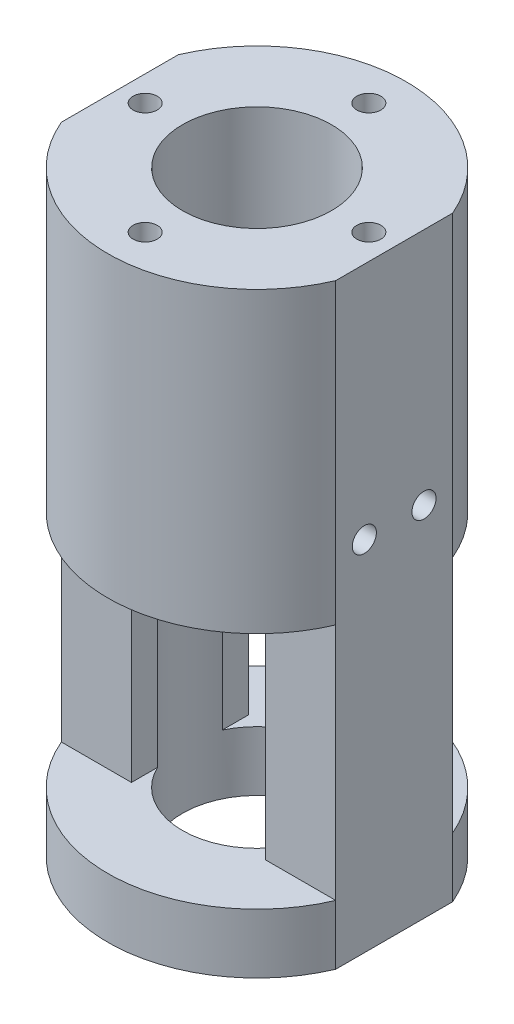
ISO-10303-21;
HEADER;
FILE_DESCRIPTION(('STEP AP214'),'2;1');
FILE_NAME('part.step','',(''),(''),'','','');
FILE_SCHEMA(('AUTOMOTIVE_DESIGN { 1 0 10303 214 1 1 1 1 }'));
ENDSEC;
DATA;
#1=APPLICATION_CONTEXT('core data for automotive mechanical design processes');
#2=APPLICATION_PROTOCOL_DEFINITION('international standard','automotive_design',2000,#1);
#3=PRODUCT_CONTEXT('',#1,'mechanical');
#4=PRODUCT('Part','Part','',(#3));
#5=PRODUCT_RELATED_PRODUCT_CATEGORY('part','',(#4));
#6=PRODUCT_DEFINITION_FORMATION('','',#4);
#7=PRODUCT_DEFINITION_CONTEXT('part definition',#1,'design');
#8=PRODUCT_DEFINITION('design','',#6,#7);
#9=PRODUCT_DEFINITION_SHAPE('','',#8);
#10=(LENGTH_UNIT() NAMED_UNIT(*) SI_UNIT(.MILLI.,.METRE.));
#11=(NAMED_UNIT(*) PLANE_ANGLE_UNIT() SI_UNIT($,.RADIAN.));
#12=(NAMED_UNIT(*) SI_UNIT($,.STERADIAN.) SOLID_ANGLE_UNIT());
#13=UNCERTAINTY_MEASURE_WITH_UNIT(LENGTH_MEASURE(1.E-05),#10,'distance_accuracy_value','');
#14=(GEOMETRIC_REPRESENTATION_CONTEXT(3) GLOBAL_UNCERTAINTY_ASSIGNED_CONTEXT((#13)) GLOBAL_UNIT_ASSIGNED_CONTEXT((#10,
#11,#12)) REPRESENTATION_CONTEXT('',''));
#15=CARTESIAN_POINT('',(0.,0.,0.));
#16=DIRECTION('',(0.,0.,1.));
#17=DIRECTION('',(1.,0.,0.));
#18=AXIS2_PLACEMENT_3D('',#15,#16,#17);
#19=CARTESIAN_POINT('',(0.,100.,0.));
#20=DIRECTION('',(0.,-1.,0.));
#21=DIRECTION('',(0.,0.,-1.));
#22=AXIS2_PLACEMENT_3D('',#19,#20,#21);
#23=CYLINDRICAL_SURFACE('',#22,25.);
#24=CARTESIAN_POINT('',(0.,50.,0.));
#25=DIRECTION('',(0.,-1.,0.));
#26=DIRECTION('',(0.,0.,-1.));
#27=AXIS2_PLACEMENT_3D('',#24,#25,#26);
#28=CIRCLE('',#27,25.);
#29=CARTESIAN_POINT('',(23.,50.,9.79795897113273));
#30=VERTEX_POINT('',#29);
#31=CARTESIAN_POINT('',(-23.,50.,9.79795897113273));
#32=VERTEX_POINT('',#31);
#33=EDGE_CURVE('E250',#30,#32,#28,.T.);
#34=ORIENTED_EDGE('',*,*,#33,.F.);
#35=DIRECTION('',(0.,-1.,0.));
#36=VECTOR('',#35,1.);
#37=CARTESIAN_POINT('',(23.,100.,9.79795897113272));
#38=LINE('',#37,#36);
#39=CARTESIAN_POINT('',(23.,100.,9.79795897113272));
#40=VERTEX_POINT('',#39);
#41=EDGE_CURVE('E297',#30,#40,#38,.F.);
#42=ORIENTED_EDGE('',*,*,#41,.T.);
#43=CARTESIAN_POINT('',(0.,100.,0.));
#44=DIRECTION('',(0.,1.,0.));
#45=DIRECTION('',(0.,0.,1.));
#46=AXIS2_PLACEMENT_3D('',#43,#44,#45);
#47=CIRCLE('',#46,25.);
#48=CARTESIAN_POINT('',(-23.,100.,9.79795897113271));
#49=VERTEX_POINT('',#48);
#50=EDGE_CURVE('E323',#49,#40,#47,.T.);
#51=ORIENTED_EDGE('',*,*,#50,.F.);
#52=DIRECTION('',(0.,-1.,0.));
#53=VECTOR('',#52,1.);
#54=CARTESIAN_POINT('',(-23.,100.,9.79795897113271));
#55=LINE('',#54,#53);
#56=EDGE_CURVE('E308',#32,#49,#55,.F.);
#57=ORIENTED_EDGE('',*,*,#56,.F.);
#58=EDGE_LOOP('',(#34,#42,#51,#57));
#59=FACE_BOUND('',#58,.T.);
#60=ADVANCED_FACE('F38',(#59),#23,.T.);
#61=CARTESIAN_POINT('',(0.,9.99999999999999,0.));
#62=DIRECTION('',(0.,1.,0.));
#63=DIRECTION('',(0.,0.,1.));
#64=AXIS2_PLACEMENT_3D('',#61,#62,#63);
#65=CIRCLE('',#64,25.);
#66=CARTESIAN_POINT('',(-23.,10.,9.79795897113274));
#67=VERTEX_POINT('',#66);
#68=CARTESIAN_POINT('',(23.,10.,9.79795897113272));
#69=VERTEX_POINT('',#68);
#70=EDGE_CURVE('E244',#67,#69,#65,.T.);
#71=ORIENTED_EDGE('',*,*,#70,.F.);
#72=CARTESIAN_POINT('',(-23.,0.,9.79795897113271));
#73=VERTEX_POINT('',#72);
#74=EDGE_CURVE('E309',#73,#67,#55,.F.);
#75=ORIENTED_EDGE('',*,*,#74,.F.);
#76=CARTESIAN_POINT('',(0.,0.,0.));
#77=DIRECTION('',(0.,1.,0.));
#78=DIRECTION('',(0.,0.,1.));
#79=AXIS2_PLACEMENT_3D('',#76,#77,#78);
#80=CIRCLE('',#79,25.);
#81=CARTESIAN_POINT('',(23.,0.,9.79795897113272));
#82=VERTEX_POINT('',#81);
#83=EDGE_CURVE('E328',#73,#82,#80,.T.);
#84=ORIENTED_EDGE('',*,*,#83,.T.);
#85=EDGE_CURVE('E298',#82,#69,#38,.F.);
#86=ORIENTED_EDGE('',*,*,#85,.T.);
#87=EDGE_LOOP('',(#71,#75,#84,#86));
#88=FACE_BOUND('',#87,.T.);
#89=ADVANCED_FACE('F403',(#88),#23,.T.);
#90=CARTESIAN_POINT('',(0.,100.,0.));
#91=DIRECTION('',(0.,-1.,0.));
#92=DIRECTION('',(0.,0.,-1.));
#93=AXIS2_PLACEMENT_3D('',#90,#91,#92);
#94=CYLINDRICAL_SURFACE('',#93,12.5);
#95=DIRECTION('',(0.,-1.,0.));
#96=VECTOR('',#95,1.);
#97=CARTESIAN_POINT('',(11.25,100.,5.44862367942584));
#98=LINE('',#97,#96);
#99=CARTESIAN_POINT('',(11.25,50.,5.44862367942584));
#100=VERTEX_POINT('',#99);
#101=CARTESIAN_POINT('',(11.25,10.,5.44862367942582));
#102=VERTEX_POINT('',#101);
#103=EDGE_CURVE('E223',#100,#102,#98,.T.);
#104=ORIENTED_EDGE('',*,*,#103,.F.);
#105=CARTESIAN_POINT('',(0.,50.,0.));
#106=DIRECTION('',(0.,-1.,0.));
#107=DIRECTION('',(0.,0.,-1.));
#108=AXIS2_PLACEMENT_3D('',#105,#106,#107);
#109=CIRCLE('',#108,12.5);
#110=CARTESIAN_POINT('',(-11.25,50.,5.4486236794258));
#111=VERTEX_POINT('',#110);
#112=EDGE_CURVE('E341',#100,#111,#109,.T.);
#113=ORIENTED_EDGE('',*,*,#112,.T.);
#114=DIRECTION('',(0.,-1.,0.));
#115=VECTOR('',#114,1.);
#116=CARTESIAN_POINT('',(-11.25,100.,5.44862367942575));
#117=LINE('',#116,#115);
#118=CARTESIAN_POINT('',(-11.25,10.,5.44862367942585));
#119=VERTEX_POINT('',#118);
#120=EDGE_CURVE('E229',#119,#111,#117,.F.);
#121=ORIENTED_EDGE('',*,*,#120,.F.);
#122=CARTESIAN_POINT('',(0.,9.99999999999999,0.));
#123=DIRECTION('',(0.,1.,0.));
#124=DIRECTION('',(0.,0.,1.));
#125=AXIS2_PLACEMENT_3D('',#122,#123,#124);
#126=CIRCLE('',#125,12.5);
#127=EDGE_CURVE('E339',#119,#102,#126,.T.);
#128=ORIENTED_EDGE('',*,*,#127,.T.);
#129=EDGE_LOOP('',(#104,#113,#121,#128));
#130=FACE_BOUND('',#129,.T.);
#131=DIRECTION('',(0.,-1.,0.));
#132=VECTOR('',#131,1.);
#133=CARTESIAN_POINT('',(-11.25,100.,-5.44862367942575));
#134=LINE('',#133,#132);
#135=CARTESIAN_POINT('',(-11.25,50.,-5.4486236794258));
#136=VERTEX_POINT('',#135);
#137=CARTESIAN_POINT('',(-11.25,10.,-5.44862367942585));
#138=VERTEX_POINT('',#137);
#139=EDGE_CURVE('E232',#136,#138,#134,.T.);
#140=ORIENTED_EDGE('',*,*,#139,.F.);
#141=CARTESIAN_POINT('',(0.,50.,0.));
#142=DIRECTION('',(0.,1.,0.));
#143=DIRECTION('',(0.,0.,1.));
#144=AXIS2_PLACEMENT_3D('',#141,#142,#143);
#145=CIRCLE('',#144,12.5);
#146=CARTESIAN_POINT('',(11.25,50.,-5.44862367942584));
#147=VERTEX_POINT('',#146);
#148=EDGE_CURVE('E335',#147,#136,#145,.T.);
#149=ORIENTED_EDGE('',*,*,#148,.F.);
#150=DIRECTION('',(0.,-1.,0.));
#151=VECTOR('',#150,1.);
#152=CARTESIAN_POINT('',(11.25,100.,-5.44862367942584));
#153=LINE('',#152,#151);
#154=CARTESIAN_POINT('',(11.25,10.,-5.44862367942582));
#155=VERTEX_POINT('',#154);
#156=EDGE_CURVE('E220',#155,#147,#153,.F.);
#157=ORIENTED_EDGE('',*,*,#156,.F.);
#158=CARTESIAN_POINT('',(0.,9.99999999999999,0.));
#159=DIRECTION('',(0.,-1.,0.));
#160=DIRECTION('',(0.,0.,-1.));
#161=AXIS2_PLACEMENT_3D('',#158,#159,#160);
#162=CIRCLE('',#161,12.5);
#163=EDGE_CURVE('E337',#138,#155,#162,.T.);
#164=ORIENTED_EDGE('',*,*,#163,.F.);
#165=EDGE_LOOP('',(#140,#149,#157,#164));
#166=FACE_BOUND('',#165,.T.);
#167=CARTESIAN_POINT('',(0.,100.,0.));
#168=DIRECTION('',(0.,1.,0.));
#169=DIRECTION('',(0.,0.,1.));
#170=AXIS2_PLACEMENT_3D('',#167,#168,#169);
#171=CIRCLE('',#170,12.5);
#172=CARTESIAN_POINT('',(0.,100.,12.5));
#173=VERTEX_POINT('',#172);
#174=EDGE_CURVE('E317',#173,#173,#171,.T.);
#175=ORIENTED_EDGE('',*,*,#174,.T.);
#176=EDGE_LOOP('',(#175));
#177=FACE_BOUND('',#176,.T.);
#178=CARTESIAN_POINT('',(0.,0.,0.));
#179=DIRECTION('',(0.,1.,0.));
#180=DIRECTION('',(0.,0.,1.));
#181=AXIS2_PLACEMENT_3D('',#178,#179,#180);
#182=CIRCLE('',#181,12.5);
#183=CARTESIAN_POINT('',(0.,0.,12.5));
#184=VERTEX_POINT('',#183);
#185=EDGE_CURVE('E316',#184,#184,#182,.T.);
#186=ORIENTED_EDGE('',*,*,#185,.F.);
#187=EDGE_LOOP('',(#186));
#188=FACE_BOUND('',#187,.T.);
#189=ADVANCED_FACE('F412',(#130,#166,#177,#188),#94,.F.);
#190=DIRECTION('',(0.,-1.,0.));
#191=VECTOR('',#190,1.);
#192=CARTESIAN_POINT('',(-23.,100.,-9.79795897113271));
#193=LINE('',#192,#191);
#194=CARTESIAN_POINT('',(-23.,10.,-9.79795897113274));
#195=VERTEX_POINT('',#194);
#196=CARTESIAN_POINT('',(-23.,0.,-9.79795897113271));
#197=VERTEX_POINT('',#196);
#198=EDGE_CURVE('E312',#195,#197,#193,.T.);
#199=ORIENTED_EDGE('',*,*,#198,.F.);
#200=CARTESIAN_POINT('',(0.,9.99999999999999,0.));
#201=DIRECTION('',(0.,-1.,0.));
#202=DIRECTION('',(0.,0.,-1.));
#203=AXIS2_PLACEMENT_3D('',#200,#201,#202);
#204=CIRCLE('',#203,25.);
#205=CARTESIAN_POINT('',(23.,10.,-9.79795897113274));
#206=VERTEX_POINT('',#205);
#207=EDGE_CURVE('E268',#195,#206,#204,.T.);
#208=ORIENTED_EDGE('',*,*,#207,.T.);
#209=DIRECTION('',(0.,-1.,0.));
#210=VECTOR('',#209,1.);
#211=CARTESIAN_POINT('',(23.,100.,-9.79795897113272));
#212=LINE('',#211,#210);
#213=CARTESIAN_POINT('',(23.,0.,-9.79795897113272));
#214=VERTEX_POINT('',#213);
#215=EDGE_CURVE('E301',#206,#214,#212,.T.);
#216=ORIENTED_EDGE('',*,*,#215,.T.);
#217=EDGE_CURVE('E320',#214,#197,#80,.T.);
#218=ORIENTED_EDGE('',*,*,#217,.T.);
#219=EDGE_LOOP('',(#199,#208,#216,#218));
#220=FACE_BOUND('',#219,.T.);
#221=ADVANCED_FACE('F395',(#220),#23,.T.);
#222=CARTESIAN_POINT('',(23.,100.,-9.79795897113272));
#223=VERTEX_POINT('',#222);
#224=CARTESIAN_POINT('',(23.,50.,-9.79795897113272));
#225=VERTEX_POINT('',#224);
#226=EDGE_CURVE('E302',#223,#225,#212,.T.);
#227=ORIENTED_EDGE('',*,*,#226,.T.);
#228=CARTESIAN_POINT('',(0.,50.,0.));
#229=DIRECTION('',(0.,1.,0.));
#230=DIRECTION('',(0.,0.,1.));
#231=AXIS2_PLACEMENT_3D('',#228,#229,#230);
#232=CIRCLE('',#231,25.);
#233=CARTESIAN_POINT('',(-23.,50.,-9.79795897113273));
#234=VERTEX_POINT('',#233);
#235=EDGE_CURVE('E262',#225,#234,#232,.T.);
#236=ORIENTED_EDGE('',*,*,#235,.T.);
#237=CARTESIAN_POINT('',(-23.,100.,-9.79795897113271));
#238=VERTEX_POINT('',#237);
#239=EDGE_CURVE('E313',#238,#234,#193,.T.);
#240=ORIENTED_EDGE('',*,*,#239,.F.);
#241=EDGE_CURVE('E327',#223,#238,#47,.T.);
#242=ORIENTED_EDGE('',*,*,#241,.F.);
#243=EDGE_LOOP('',(#227,#236,#240,#242));
#244=FACE_BOUND('',#243,.T.);
#245=ADVANCED_FACE('F377',(#244),#23,.T.);
#246=CARTESIAN_POINT('',(0.,100.,0.));
#247=DIRECTION('',(0.,1.,0.));
#248=DIRECTION('',(0.,0.,1.));
#249=AXIS2_PLACEMENT_3D('',#246,#247,#248);
#250=PLANE('',#249);
#251=CARTESIAN_POINT('',(0.,100.,-18.75));
#252=DIRECTION('',(0.,1.,0.));
#253=DIRECTION('',(0.,0.,1.));
#254=AXIS2_PLACEMENT_3D('',#251,#252,#253);
#255=CIRCLE('',#254,2.0193);
#256=CARTESIAN_POINT('',(0.,100.,-16.7307));
#257=VERTEX_POINT('',#256);
#258=EDGE_CURVE('E270',#257,#257,#255,.T.);
#259=ORIENTED_EDGE('',*,*,#258,.F.);
#260=EDGE_LOOP('',(#259));
#261=FACE_BOUND('',#260,.T.);
#262=CARTESIAN_POINT('',(-18.75,100.,0.));
#263=DIRECTION('',(0.,1.,0.));
#264=DIRECTION('',(0.,0.,1.));
#265=AXIS2_PLACEMENT_3D('',#262,#263,#264);
#266=CIRCLE('',#265,2.0193);
#267=CARTESIAN_POINT('',(-18.75,100.,2.0193));
#268=VERTEX_POINT('',#267);
#269=EDGE_CURVE('E276',#268,#268,#266,.T.);
#270=ORIENTED_EDGE('',*,*,#269,.F.);
#271=EDGE_LOOP('',(#270));
#272=FACE_BOUND('',#271,.T.);
#273=CARTESIAN_POINT('',(0.,100.,18.75));
#274=DIRECTION('',(0.,1.,0.));
#275=DIRECTION('',(0.,0.,1.));
#276=AXIS2_PLACEMENT_3D('',#273,#274,#275);
#277=CIRCLE('',#276,2.0193);
#278=CARTESIAN_POINT('',(0.,100.,20.7693));
#279=VERTEX_POINT('',#278);
#280=EDGE_CURVE('E282',#279,#279,#277,.T.);
#281=ORIENTED_EDGE('',*,*,#280,.F.);
#282=EDGE_LOOP('',(#281));
#283=FACE_BOUND('',#282,.T.);
#284=CARTESIAN_POINT('',(18.75,100.,0.));
#285=DIRECTION('',(0.,1.,0.));
#286=DIRECTION('',(0.,0.,1.));
#287=AXIS2_PLACEMENT_3D('',#284,#285,#286);
#288=CIRCLE('',#287,2.0193);
#289=CARTESIAN_POINT('',(18.75,100.,2.0193));
#290=VERTEX_POINT('',#289);
#291=EDGE_CURVE('E288',#290,#290,#288,.T.);
#292=ORIENTED_EDGE('',*,*,#291,.F.);
#293=EDGE_LOOP('',(#292));
#294=FACE_BOUND('',#293,.T.);
#295=DIRECTION('',(0.,0.,-1.));
#296=VECTOR('',#295,1.);
#297=CARTESIAN_POINT('',(23.,100.,0.));
#298=LINE('',#297,#296);
#299=EDGE_CURVE('E294',#40,#223,#298,.T.);
#300=ORIENTED_EDGE('',*,*,#299,.T.);
#301=ORIENTED_EDGE('',*,*,#241,.T.);
#302=DIRECTION('',(0.,0.,-1.));
#303=VECTOR('',#302,1.);
#304=CARTESIAN_POINT('',(-23.,100.,0.));
#305=LINE('',#304,#303);
#306=EDGE_CURVE('E305',#49,#238,#305,.T.);
#307=ORIENTED_EDGE('',*,*,#306,.F.);
#308=ORIENTED_EDGE('',*,*,#50,.T.);
#309=EDGE_LOOP('',(#300,#301,#307,#308));
#310=FACE_BOUND('',#309,.T.);
#311=ORIENTED_EDGE('',*,*,#174,.F.);
#312=EDGE_LOOP('',(#311));
#313=FACE_BOUND('',#312,.T.);
#314=ADVANCED_FACE('F371',(#261,#272,#283,#294,#310,#313),#250,.T.);
#315=CARTESIAN_POINT('',(0.,0.,0.));
#316=DIRECTION('',(0.,1.,0.));
#317=DIRECTION('',(0.,0.,1.));
#318=AXIS2_PLACEMENT_3D('',#315,#316,#317);
#319=PLANE('',#318);
#320=ORIENTED_EDGE('',*,*,#185,.T.);
#321=EDGE_LOOP('',(#320));
#322=FACE_BOUND('',#321,.T.);
#323=ORIENTED_EDGE('',*,*,#217,.F.);
#324=DIRECTION('',(0.,0.,1.));
#325=VECTOR('',#324,1.);
#326=CARTESIAN_POINT('',(23.,0.,0.));
#327=LINE('',#326,#325);
#328=EDGE_CURVE('E332',#214,#82,#327,.T.);
#329=ORIENTED_EDGE('',*,*,#328,.T.);
#330=ORIENTED_EDGE('',*,*,#83,.F.);
#331=DIRECTION('',(0.,0.,1.));
#332=VECTOR('',#331,1.);
#333=CARTESIAN_POINT('',(-23.,0.,0.));
#334=LINE('',#333,#332);
#335=EDGE_CURVE('E326',#197,#73,#334,.T.);
#336=ORIENTED_EDGE('',*,*,#335,.F.);
#337=EDGE_LOOP('',(#323,#329,#330,#336));
#338=FACE_BOUND('',#337,.T.);
#339=ADVANCED_FACE('F400',(#322,#338),#319,.F.);
#340=CARTESIAN_POINT('',(-23.,100.,0.));
#341=DIRECTION('',(-1.,0.,0.));
#342=DIRECTION('',(0.,0.,1.));
#343=AXIS2_PLACEMENT_3D('',#340,#341,#342);
#344=PLANE('',#343);
#345=CARTESIAN_POINT('',(-23.,60.,5.));
#346=DIRECTION('',(-1.,0.,0.));
#347=DIRECTION('',(0.,0.,1.));
#348=AXIS2_PLACEMENT_3D('',#345,#346,#347);
#349=CIRCLE('',#348,2.01929999999999);
#350=CARTESIAN_POINT('',(-23.,60.,7.01929999999998));
#351=VERTEX_POINT('',#350);
#352=EDGE_CURVE('E184',#351,#351,#349,.T.);
#353=ORIENTED_EDGE('',*,*,#352,.F.);
#354=EDGE_LOOP('',(#353));
#355=FACE_BOUND('',#354,.T.);
#356=CARTESIAN_POINT('',(-23.,60.,-5.));
#357=DIRECTION('',(-1.,0.,0.));
#358=DIRECTION('',(0.,0.,1.));
#359=AXIS2_PLACEMENT_3D('',#356,#357,#358);
#360=CIRCLE('',#359,2.01929999999999);
#361=CARTESIAN_POINT('',(-23.,60.,-2.98070000000002));
#362=VERTEX_POINT('',#361);
#363=EDGE_CURVE('E183',#362,#362,#360,.T.);
#364=ORIENTED_EDGE('',*,*,#363,.F.);
#365=EDGE_LOOP('',(#364));
#366=FACE_BOUND('',#365,.T.);
#367=ORIENTED_EDGE('',*,*,#239,.T.);
#368=DIRECTION('',(0.,-1.,0.));
#369=VECTOR('',#368,1.);
#370=CARTESIAN_POINT('',(-23.,50.,-9.79795897113273));
#371=LINE('',#370,#369);
#372=EDGE_CURVE('E255',#234,#195,#371,.T.);
#373=ORIENTED_EDGE('',*,*,#372,.T.);
#374=ORIENTED_EDGE('',*,*,#198,.T.);
#375=ORIENTED_EDGE('',*,*,#335,.T.);
#376=ORIENTED_EDGE('',*,*,#74,.T.);
#377=DIRECTION('',(0.,-1.,0.));
#378=VECTOR('',#377,1.);
#379=CARTESIAN_POINT('',(-23.,50.,9.79795897113273));
#380=LINE('',#379,#378);
#381=EDGE_CURVE('E238',#32,#67,#380,.T.);
#382=ORIENTED_EDGE('',*,*,#381,.F.);
#383=ORIENTED_EDGE('',*,*,#56,.T.);
#384=ORIENTED_EDGE('',*,*,#306,.T.);
#385=EDGE_LOOP('',(#367,#373,#374,#375,#376,#382,#383,#384));
#386=FACE_BOUND('',#385,.T.);
#387=ADVANCED_FACE('F375',(#355,#366,#386),#344,.T.);
#388=CARTESIAN_POINT('',(23.,100.,0.));
#389=DIRECTION('',(-1.,0.,0.));
#390=DIRECTION('',(0.,0.,1.));
#391=AXIS2_PLACEMENT_3D('',#388,#389,#390);
#392=PLANE('',#391);
#393=CARTESIAN_POINT('',(23.,60.,5.));
#394=DIRECTION('',(1.,0.,0.));
#395=DIRECTION('',(0.,0.,-1.));
#396=AXIS2_PLACEMENT_3D('',#393,#394,#395);
#397=CIRCLE('',#396,2.01929999999999);
#398=CARTESIAN_POINT('',(23.,60.,2.98070000000001));
#399=VERTEX_POINT('',#398);
#400=EDGE_CURVE('E194',#399,#399,#397,.T.);
#401=ORIENTED_EDGE('',*,*,#400,.F.);
#402=EDGE_LOOP('',(#401));
#403=FACE_BOUND('',#402,.T.);
#404=CARTESIAN_POINT('',(23.,60.,-5.));
#405=DIRECTION('',(1.,0.,0.));
#406=DIRECTION('',(0.,0.,-1.));
#407=AXIS2_PLACEMENT_3D('',#404,#405,#406);
#408=CIRCLE('',#407,2.01929999999999);
#409=CARTESIAN_POINT('',(23.,60.,-7.01929999999999));
#410=VERTEX_POINT('',#409);
#411=EDGE_CURVE('E200',#410,#410,#408,.T.);
#412=ORIENTED_EDGE('',*,*,#411,.F.);
#413=EDGE_LOOP('',(#412));
#414=FACE_BOUND('',#413,.T.);
#415=ORIENTED_EDGE('',*,*,#299,.F.);
#416=ORIENTED_EDGE('',*,*,#41,.F.);
#417=DIRECTION('',(0.,-1.,0.));
#418=VECTOR('',#417,1.);
#419=CARTESIAN_POINT('',(23.,50.,9.79795897113273));
#420=LINE('',#419,#418);
#421=EDGE_CURVE('E235',#30,#69,#420,.T.);
#422=ORIENTED_EDGE('',*,*,#421,.T.);
#423=ORIENTED_EDGE('',*,*,#85,.F.);
#424=ORIENTED_EDGE('',*,*,#328,.F.);
#425=ORIENTED_EDGE('',*,*,#215,.F.);
#426=DIRECTION('',(0.,-1.,0.));
#427=VECTOR('',#426,1.);
#428=CARTESIAN_POINT('',(23.,50.,-9.79795897113273));
#429=LINE('',#428,#427);
#430=EDGE_CURVE('E252',#225,#206,#429,.T.);
#431=ORIENTED_EDGE('',*,*,#430,.F.);
#432=ORIENTED_EDGE('',*,*,#226,.F.);
#433=EDGE_LOOP('',(#415,#416,#422,#423,#424,#425,#431,#432));
#434=FACE_BOUND('',#433,.T.);
#435=ADVANCED_FACE('F366',(#403,#414,#434),#392,.F.);
#436=CARTESIAN_POINT('',(18.75,70.,0.));
#437=DIRECTION('',(0.,1.,0.));
#438=DIRECTION('',(0.,0.,1.));
#439=AXIS2_PLACEMENT_3D('',#436,#437,#438);
#440=CONICAL_SURFACE('',#439,2.01929999999999,1.02974425867665);
#441=CARTESIAN_POINT('',(18.75,68.7866821519977,0.));
#442=VERTEX_POINT('',#441);
#443=VERTEX_LOOP('',#442);
#444=FACE_BOUND('',#443,.T.);
#445=CARTESIAN_POINT('',(18.75,70.,0.));
#446=DIRECTION('',(0.,1.,0.));
#447=DIRECTION('',(0.,0.,1.));
#448=AXIS2_PLACEMENT_3D('',#445,#446,#447);
#449=CIRCLE('',#448,2.01929999999999);
#450=CARTESIAN_POINT('',(18.75,70.,2.01929999999999));
#451=VERTEX_POINT('',#450);
#452=EDGE_CURVE('E291',#451,#451,#449,.T.);
#453=ORIENTED_EDGE('',*,*,#452,.T.);
#454=EDGE_LOOP('',(#453));
#455=FACE_BOUND('',#454,.T.);
#456=ADVANCED_FACE('F532',(#444,#455),#440,.F.);
#457=CARTESIAN_POINT('',(18.75,100.,0.));
#458=DIRECTION('',(0.,1.,0.));
#459=DIRECTION('',(0.,0.,1.));
#460=AXIS2_PLACEMENT_3D('',#457,#458,#459);
#461=CYLINDRICAL_SURFACE('',#460,2.01929999999999);
#462=ORIENTED_EDGE('',*,*,#452,.F.);
#463=EDGE_LOOP('',(#462));
#464=FACE_BOUND('',#463,.T.);
#465=ORIENTED_EDGE('',*,*,#291,.T.);
#466=EDGE_LOOP('',(#465));
#467=FACE_BOUND('',#466,.T.);
#468=ADVANCED_FACE('F522',(#464,#467),#461,.F.);
#469=CARTESIAN_POINT('',(0.,70.,18.75));
#470=DIRECTION('',(0.,1.,0.));
#471=DIRECTION('',(0.,0.,1.));
#472=AXIS2_PLACEMENT_3D('',#469,#470,#471);
#473=CONICAL_SURFACE('',#472,2.01929999999999,1.02974425867665);
#474=CARTESIAN_POINT('',(0.,68.7866821519977,18.75));
#475=VERTEX_POINT('',#474);
#476=VERTEX_LOOP('',#475);
#477=FACE_BOUND('',#476,.T.);
#478=CARTESIAN_POINT('',(0.,70.,18.75));
#479=DIRECTION('',(0.,1.,0.));
#480=DIRECTION('',(0.,0.,1.));
#481=AXIS2_PLACEMENT_3D('',#478,#479,#480);
#482=CIRCLE('',#481,2.01929999999999);
#483=CARTESIAN_POINT('',(0.,70.,20.7693));
#484=VERTEX_POINT('',#483);
#485=EDGE_CURVE('E285',#484,#484,#482,.T.);
#486=ORIENTED_EDGE('',*,*,#485,.T.);
#487=EDGE_LOOP('',(#486));
#488=FACE_BOUND('',#487,.T.);
#489=ADVANCED_FACE('F510',(#477,#488),#473,.F.);
#490=CARTESIAN_POINT('',(0.,100.,18.75));
#491=DIRECTION('',(0.,1.,0.));
#492=DIRECTION('',(0.,0.,1.));
#493=AXIS2_PLACEMENT_3D('',#490,#491,#492);
#494=CYLINDRICAL_SURFACE('',#493,2.01929999999999);
#495=ORIENTED_EDGE('',*,*,#485,.F.);
#496=EDGE_LOOP('',(#495));
#497=FACE_BOUND('',#496,.T.);
#498=ORIENTED_EDGE('',*,*,#280,.T.);
#499=EDGE_LOOP('',(#498));
#500=FACE_BOUND('',#499,.T.);
#501=ADVANCED_FACE('F500',(#497,#500),#494,.F.);
#502=CARTESIAN_POINT('',(-18.75,70.,0.));
#503=DIRECTION('',(0.,1.,0.));
#504=DIRECTION('',(0.,0.,1.));
#505=AXIS2_PLACEMENT_3D('',#502,#503,#504);
#506=CONICAL_SURFACE('',#505,2.01929999999999,1.02974425867665);
#507=CARTESIAN_POINT('',(-18.75,68.7866821519977,0.));
#508=VERTEX_POINT('',#507);
#509=VERTEX_LOOP('',#508);
#510=FACE_BOUND('',#509,.T.);
#511=CARTESIAN_POINT('',(-18.75,70.,0.));
#512=DIRECTION('',(0.,1.,0.));
#513=DIRECTION('',(0.,0.,1.));
#514=AXIS2_PLACEMENT_3D('',#511,#512,#513);
#515=CIRCLE('',#514,2.01929999999999);
#516=CARTESIAN_POINT('',(-18.75,70.,2.01929999999999));
#517=VERTEX_POINT('',#516);
#518=EDGE_CURVE('E279',#517,#517,#515,.T.);
#519=ORIENTED_EDGE('',*,*,#518,.T.);
#520=EDGE_LOOP('',(#519));
#521=FACE_BOUND('',#520,.T.);
#522=ADVANCED_FACE('F488',(#510,#521),#506,.F.);
#523=CARTESIAN_POINT('',(-18.75,100.,0.));
#524=DIRECTION('',(0.,1.,0.));
#525=DIRECTION('',(0.,0.,1.));
#526=AXIS2_PLACEMENT_3D('',#523,#524,#525);
#527=CYLINDRICAL_SURFACE('',#526,2.01929999999999);
#528=ORIENTED_EDGE('',*,*,#518,.F.);
#529=EDGE_LOOP('',(#528));
#530=FACE_BOUND('',#529,.T.);
#531=ORIENTED_EDGE('',*,*,#269,.T.);
#532=EDGE_LOOP('',(#531));
#533=FACE_BOUND('',#532,.T.);
#534=ADVANCED_FACE('F478',(#530,#533),#527,.F.);
#535=CARTESIAN_POINT('',(0.,70.,-18.75));
#536=DIRECTION('',(0.,1.,0.));
#537=DIRECTION('',(0.,0.,1.));
#538=AXIS2_PLACEMENT_3D('',#535,#536,#537);
#539=CONICAL_SURFACE('',#538,2.01929999999999,1.02974425867665);
#540=CARTESIAN_POINT('',(0.,68.7866821519977,-18.75));
#541=VERTEX_POINT('',#540);
#542=VERTEX_LOOP('',#541);
#543=FACE_BOUND('',#542,.T.);
#544=CARTESIAN_POINT('',(0.,70.,-18.75));
#545=DIRECTION('',(0.,1.,0.));
#546=DIRECTION('',(0.,0.,1.));
#547=AXIS2_PLACEMENT_3D('',#544,#545,#546);
#548=CIRCLE('',#547,2.01929999999999);
#549=CARTESIAN_POINT('',(0.,70.,-16.7307));
#550=VERTEX_POINT('',#549);
#551=EDGE_CURVE('E273',#550,#550,#548,.T.);
#552=ORIENTED_EDGE('',*,*,#551,.T.);
#553=EDGE_LOOP('',(#552));
#554=FACE_BOUND('',#553,.T.);
#555=ADVANCED_FACE('F466',(#543,#554),#539,.F.);
#556=CARTESIAN_POINT('',(0.,100.,-18.75));
#557=DIRECTION('',(0.,1.,0.));
#558=DIRECTION('',(0.,0.,1.));
#559=AXIS2_PLACEMENT_3D('',#556,#557,#558);
#560=CYLINDRICAL_SURFACE('',#559,2.01929999999999);
#561=ORIENTED_EDGE('',*,*,#551,.F.);
#562=EDGE_LOOP('',(#561));
#563=FACE_BOUND('',#562,.T.);
#564=ORIENTED_EDGE('',*,*,#258,.T.);
#565=EDGE_LOOP('',(#564));
#566=FACE_BOUND('',#565,.T.);
#567=ADVANCED_FACE('F459',(#563,#566),#560,.F.);
#568=CARTESIAN_POINT('',(-23.,10.,-9.79795897113274));
#569=DIRECTION('',(0.,-1.,0.));
#570=DIRECTION('',(0.,0.,-1.));
#571=AXIS2_PLACEMENT_3D('',#568,#569,#570);
#572=PLANE('',#571);
#573=DIRECTION('',(1.,0.,0.));
#574=VECTOR('',#573,1.);
#575=CARTESIAN_POINT('',(-23.,10.,-9.79795897113274));
#576=LINE('',#575,#574);
#577=CARTESIAN_POINT('',(11.25,10.,-9.79795897113274));
#578=VERTEX_POINT('',#577);
#579=EDGE_CURVE('E263',#578,#206,#576,.T.);
#580=ORIENTED_EDGE('',*,*,#579,.T.);
#581=ORIENTED_EDGE('',*,*,#207,.F.);
#582=CARTESIAN_POINT('',(-11.25,9.99999999999999,-9.79795897113274));
#583=VERTEX_POINT('',#582);
#584=EDGE_CURVE('E259',#195,#583,#576,.T.);
#585=ORIENTED_EDGE('',*,*,#584,.T.);
#586=DIRECTION('',(0.,0.,1.));
#587=VECTOR('',#586,1.);
#588=CARTESIAN_POINT('',(-11.25,9.99999999999999,-25.));
#589=LINE('',#588,#587);
#590=EDGE_CURVE('E215',#583,#138,#589,.T.);
#591=ORIENTED_EDGE('',*,*,#590,.T.);
#592=ORIENTED_EDGE('',*,*,#163,.T.);
#593=DIRECTION('',(0.,0.,1.));
#594=VECTOR('',#593,1.);
#595=CARTESIAN_POINT('',(11.25,10.,-25.));
#596=LINE('',#595,#594);
#597=EDGE_CURVE('E52',#578,#155,#596,.T.);
#598=ORIENTED_EDGE('',*,*,#597,.F.);
#599=EDGE_LOOP('',(#580,#581,#585,#591,#592,#598));
#600=FACE_BOUND('',#599,.T.);
#601=ADVANCED_FACE('F465',(#600),#572,.F.);
#602=CARTESIAN_POINT('',(-23.,50.,-9.79795897113273));
#603=DIRECTION('',(0.,1.,0.));
#604=DIRECTION('',(0.,0.,1.));
#605=AXIS2_PLACEMENT_3D('',#602,#603,#604);
#606=PLANE('',#605);
#607=DIRECTION('',(1.,0.,0.));
#608=VECTOR('',#607,1.);
#609=CARTESIAN_POINT('',(-23.,50.,-9.79795897113273));
#610=LINE('',#609,#608);
#611=CARTESIAN_POINT('',(11.25,50.,-9.79795897113273));
#612=VERTEX_POINT('',#611);
#613=EDGE_CURVE('E258',#612,#225,#610,.T.);
#614=ORIENTED_EDGE('',*,*,#613,.F.);
#615=DIRECTION('',(0.,0.,1.));
#616=VECTOR('',#615,1.);
#617=CARTESIAN_POINT('',(11.25,50.,-25.));
#618=LINE('',#617,#616);
#619=EDGE_CURVE('E209',#612,#147,#618,.T.);
#620=ORIENTED_EDGE('',*,*,#619,.T.);
#621=ORIENTED_EDGE('',*,*,#148,.T.);
#622=DIRECTION('',(0.,0.,1.));
#623=VECTOR('',#622,1.);
#624=CARTESIAN_POINT('',(-11.25,50.,-25.));
#625=LINE('',#624,#623);
#626=CARTESIAN_POINT('',(-11.25,50.,-9.79795897113273));
#627=VERTEX_POINT('',#626);
#628=EDGE_CURVE('E208',#627,#136,#625,.T.);
#629=ORIENTED_EDGE('',*,*,#628,.F.);
#630=EDGE_CURVE('E264',#234,#627,#610,.T.);
#631=ORIENTED_EDGE('',*,*,#630,.F.);
#632=ORIENTED_EDGE('',*,*,#235,.F.);
#633=EDGE_LOOP('',(#614,#620,#621,#629,#631,#632));
#634=FACE_BOUND('',#633,.T.);
#635=ADVANCED_FACE('F384',(#634),#606,.F.);
#636=CARTESIAN_POINT('',(-23.,50.,-9.79795897113273));
#637=DIRECTION('',(0.,0.,1.));
#638=DIRECTION('',(0.,-1.,0.));
#639=AXIS2_PLACEMENT_3D('',#636,#637,#638);
#640=PLANE('',#639);
#641=ORIENTED_EDGE('',*,*,#630,.T.);
#642=DIRECTION('',(0.,-1.,0.));
#643=VECTOR('',#642,1.);
#644=CARTESIAN_POINT('',(-11.25,50.,-9.79795897113273));
#645=LINE('',#644,#643);
#646=EDGE_CURVE('E226',#627,#583,#645,.T.);
#647=ORIENTED_EDGE('',*,*,#646,.T.);
#648=ORIENTED_EDGE('',*,*,#584,.F.);
#649=ORIENTED_EDGE('',*,*,#372,.F.);
#650=EDGE_LOOP('',(#641,#647,#648,#649));
#651=FACE_BOUND('',#650,.T.);
#652=ADVANCED_FACE('F388',(#651),#640,.F.);
#653=ORIENTED_EDGE('',*,*,#579,.F.);
#654=DIRECTION('',(0.,1.,0.));
#655=VECTOR('',#654,1.);
#656=CARTESIAN_POINT('',(11.25,50.,-9.79795897113273));
#657=LINE('',#656,#655);
#658=EDGE_CURVE('E217',#578,#612,#657,.T.);
#659=ORIENTED_EDGE('',*,*,#658,.T.);
#660=ORIENTED_EDGE('',*,*,#613,.T.);
#661=ORIENTED_EDGE('',*,*,#430,.T.);
#662=EDGE_LOOP('',(#653,#659,#660,#661));
#663=FACE_BOUND('',#662,.T.);
#664=ADVANCED_FACE('F667',(#663),#640,.F.);
#665=CARTESIAN_POINT('',(-23.,50.,9.79795897113273));
#666=DIRECTION('',(0.,-1.,0.));
#667=DIRECTION('',(0.,0.,-1.));
#668=AXIS2_PLACEMENT_3D('',#665,#666,#667);
#669=PLANE('',#668);
#670=ORIENTED_EDGE('',*,*,#33,.T.);
#671=DIRECTION('',(1.,0.,0.));
#672=VECTOR('',#671,1.);
#673=CARTESIAN_POINT('',(-23.,50.,9.79795897113273));
#674=LINE('',#673,#672);
#675=CARTESIAN_POINT('',(-11.25,50.,9.79795897113273));
#676=VERTEX_POINT('',#675);
#677=EDGE_CURVE('E241',#32,#676,#674,.T.);
#678=ORIENTED_EDGE('',*,*,#677,.T.);
#679=EDGE_CURVE('E206',#111,#676,#625,.T.);
#680=ORIENTED_EDGE('',*,*,#679,.F.);
#681=ORIENTED_EDGE('',*,*,#112,.F.);
#682=CARTESIAN_POINT('',(11.25,50.,9.79795897113273));
#683=VERTEX_POINT('',#682);
#684=EDGE_CURVE('E210',#100,#683,#618,.T.);
#685=ORIENTED_EDGE('',*,*,#684,.T.);
#686=EDGE_CURVE('E245',#683,#30,#674,.T.);
#687=ORIENTED_EDGE('',*,*,#686,.T.);
#688=EDGE_LOOP('',(#670,#678,#680,#681,#685,#687));
#689=FACE_BOUND('',#688,.T.);
#690=ADVANCED_FACE('F353',(#689),#669,.T.);
#691=CARTESIAN_POINT('',(-23.,10.,9.79795897113274));
#692=DIRECTION('',(0.,1.,0.));
#693=DIRECTION('',(0.,0.,1.));
#694=AXIS2_PLACEMENT_3D('',#691,#692,#693);
#695=PLANE('',#694);
#696=DIRECTION('',(1.,0.,0.));
#697=VECTOR('',#696,1.);
#698=CARTESIAN_POINT('',(-23.,10.,9.79795897113274));
#699=LINE('',#698,#697);
#700=CARTESIAN_POINT('',(11.25,10.,9.79795897113273));
#701=VERTEX_POINT('',#700);
#702=EDGE_CURVE('E240',#701,#69,#699,.T.);
#703=ORIENTED_EDGE('',*,*,#702,.F.);
#704=EDGE_CURVE('E213',#102,#701,#596,.T.);
#705=ORIENTED_EDGE('',*,*,#704,.F.);
#706=ORIENTED_EDGE('',*,*,#127,.F.);
#707=CARTESIAN_POINT('',(-11.25,10.,9.79795897113274));
#708=VERTEX_POINT('',#707);
#709=EDGE_CURVE('E60',#119,#708,#589,.T.);
#710=ORIENTED_EDGE('',*,*,#709,.T.);
#711=EDGE_CURVE('E246',#67,#708,#699,.T.);
#712=ORIENTED_EDGE('',*,*,#711,.F.);
#713=ORIENTED_EDGE('',*,*,#70,.T.);
#714=EDGE_LOOP('',(#703,#705,#706,#710,#712,#713));
#715=FACE_BOUND('',#714,.T.);
#716=ADVANCED_FACE('F407',(#715),#695,.T.);
#717=CARTESIAN_POINT('',(-23.,50.,9.79795897113273));
#718=DIRECTION('',(0.,0.,1.));
#719=DIRECTION('',(0.,-1.,0.));
#720=AXIS2_PLACEMENT_3D('',#717,#718,#719);
#721=PLANE('',#720);
#722=DIRECTION('',(0.,-1.,0.));
#723=VECTOR('',#722,1.);
#724=CARTESIAN_POINT('',(-11.25,50.,9.79795897113273));
#725=LINE('',#724,#723);
#726=EDGE_CURVE('E11',#676,#708,#725,.T.);
#727=ORIENTED_EDGE('',*,*,#726,.F.);
#728=ORIENTED_EDGE('',*,*,#677,.F.);
#729=ORIENTED_EDGE('',*,*,#381,.T.);
#730=ORIENTED_EDGE('',*,*,#711,.T.);
#731=EDGE_LOOP('',(#727,#728,#729,#730));
#732=FACE_BOUND('',#731,.T.);
#733=ADVANCED_FACE('F406',(#732),#721,.T.);
#734=DIRECTION('',(0.,1.,0.));
#735=VECTOR('',#734,1.);
#736=CARTESIAN_POINT('',(11.25,50.,9.79795897113273));
#737=LINE('',#736,#735);
#738=EDGE_CURVE('E45',#701,#683,#737,.T.);
#739=ORIENTED_EDGE('',*,*,#738,.F.);
#740=ORIENTED_EDGE('',*,*,#702,.T.);
#741=ORIENTED_EDGE('',*,*,#421,.F.);
#742=ORIENTED_EDGE('',*,*,#686,.F.);
#743=EDGE_LOOP('',(#739,#740,#741,#742));
#744=FACE_BOUND('',#743,.T.);
#745=ADVANCED_FACE('F356',(#744),#721,.T.);
#746=CARTESIAN_POINT('',(11.25,50.,-25.));
#747=DIRECTION('',(1.,0.,0.));
#748=DIRECTION('',(0.,1.,0.));
#749=AXIS2_PLACEMENT_3D('',#746,#747,#748);
#750=PLANE('',#749);
#751=ORIENTED_EDGE('',*,*,#103,.T.);
#752=ORIENTED_EDGE('',*,*,#704,.T.);
#753=ORIENTED_EDGE('',*,*,#738,.T.);
#754=ORIENTED_EDGE('',*,*,#684,.F.);
#755=EDGE_LOOP('',(#751,#752,#753,#754));
#756=FACE_BOUND('',#755,.T.);
#757=ADVANCED_FACE('F345',(#756),#750,.F.);
#758=CARTESIAN_POINT('',(-11.25,50.,-25.));
#759=DIRECTION('',(-1.,0.,0.));
#760=DIRECTION('',(0.,-1.,0.));
#761=AXIS2_PLACEMENT_3D('',#758,#759,#760);
#762=PLANE('',#761);
#763=ORIENTED_EDGE('',*,*,#120,.T.);
#764=ORIENTED_EDGE('',*,*,#679,.T.);
#765=ORIENTED_EDGE('',*,*,#726,.T.);
#766=ORIENTED_EDGE('',*,*,#709,.F.);
#767=EDGE_LOOP('',(#763,#764,#765,#766));
#768=FACE_BOUND('',#767,.T.);
#769=ADVANCED_FACE('F411',(#768),#762,.F.);
#770=ORIENTED_EDGE('',*,*,#156,.T.);
#771=ORIENTED_EDGE('',*,*,#619,.F.);
#772=ORIENTED_EDGE('',*,*,#658,.F.);
#773=ORIENTED_EDGE('',*,*,#597,.T.);
#774=EDGE_LOOP('',(#770,#771,#772,#773));
#775=FACE_BOUND('',#774,.T.);
#776=ADVANCED_FACE('F662',(#775),#750,.F.);
#777=ORIENTED_EDGE('',*,*,#139,.T.);
#778=ORIENTED_EDGE('',*,*,#590,.F.);
#779=ORIENTED_EDGE('',*,*,#646,.F.);
#780=ORIENTED_EDGE('',*,*,#628,.T.);
#781=EDGE_LOOP('',(#777,#778,#779,#780));
#782=FACE_BOUND('',#781,.T.);
#783=ADVANCED_FACE('F585',(#782),#762,.F.);
#784=CARTESIAN_POINT('',(14.,60.,-5.));
#785=DIRECTION('',(1.,0.,0.));
#786=DIRECTION('',(0.,0.,-1.));
#787=AXIS2_PLACEMENT_3D('',#784,#785,#786);
#788=CONICAL_SURFACE('',#787,2.0193,1.02974425867666);
#789=CARTESIAN_POINT('',(12.7866821519976,60.,-5.));
#790=VERTEX_POINT('',#789);
#791=VERTEX_LOOP('',#790);
#792=FACE_BOUND('',#791,.T.);
#793=CARTESIAN_POINT('',(14.,60.,-5.));
#794=DIRECTION('',(1.,0.,0.));
#795=DIRECTION('',(0.,0.,-1.));
#796=AXIS2_PLACEMENT_3D('',#793,#794,#795);
#797=CIRCLE('',#796,2.0193);
#798=CARTESIAN_POINT('',(14.,60.,-7.0193));
#799=VERTEX_POINT('',#798);
#800=EDGE_CURVE('E203',#799,#799,#797,.T.);
#801=ORIENTED_EDGE('',*,*,#800,.T.);
#802=EDGE_LOOP('',(#801));
#803=FACE_BOUND('',#802,.T.);
#804=ADVANCED_FACE('F579',(#792,#803),#788,.F.);
#805=CARTESIAN_POINT('',(23.,60.,-5.));
#806=DIRECTION('',(1.,0.,0.));
#807=DIRECTION('',(0.,0.,-1.));
#808=AXIS2_PLACEMENT_3D('',#805,#806,#807);
#809=CYLINDRICAL_SURFACE('',#808,2.01929999999999);
#810=ORIENTED_EDGE('',*,*,#800,.F.);
#811=EDGE_LOOP('',(#810));
#812=FACE_BOUND('',#811,.T.);
#813=ORIENTED_EDGE('',*,*,#411,.T.);
#814=EDGE_LOOP('',(#813));
#815=FACE_BOUND('',#814,.T.);
#816=ADVANCED_FACE('F584',(#812,#815),#809,.F.);
#817=CARTESIAN_POINT('',(14.,60.,5.));
#818=DIRECTION('',(1.,0.,0.));
#819=DIRECTION('',(0.,0.,-1.));
#820=AXIS2_PLACEMENT_3D('',#817,#818,#819);
#821=CONICAL_SURFACE('',#820,2.0193,1.02974425867666);
#822=CARTESIAN_POINT('',(12.7866821519976,60.,5.));
#823=VERTEX_POINT('',#822);
#824=VERTEX_LOOP('',#823);
#825=FACE_BOUND('',#824,.T.);
#826=CARTESIAN_POINT('',(14.,60.,5.));
#827=DIRECTION('',(1.,0.,0.));
#828=DIRECTION('',(0.,0.,-1.));
#829=AXIS2_PLACEMENT_3D('',#826,#827,#828);
#830=CIRCLE('',#829,2.0193);
#831=CARTESIAN_POINT('',(14.,60.,2.9807));
#832=VERTEX_POINT('',#831);
#833=EDGE_CURVE('E197',#832,#832,#830,.T.);
#834=ORIENTED_EDGE('',*,*,#833,.T.);
#835=EDGE_LOOP('',(#834));
#836=FACE_BOUND('',#835,.T.);
#837=ADVANCED_FACE('F598',(#825,#836),#821,.F.);
#838=CARTESIAN_POINT('',(23.,60.,5.));
#839=DIRECTION('',(1.,0.,0.));
#840=DIRECTION('',(0.,0.,-1.));
#841=AXIS2_PLACEMENT_3D('',#838,#839,#840);
#842=CYLINDRICAL_SURFACE('',#841,2.01929999999999);
#843=ORIENTED_EDGE('',*,*,#833,.F.);
#844=EDGE_LOOP('',(#843));
#845=FACE_BOUND('',#844,.T.);
#846=ORIENTED_EDGE('',*,*,#400,.T.);
#847=EDGE_LOOP('',(#846));
#848=FACE_BOUND('',#847,.T.);
#849=ADVANCED_FACE('F609',(#845,#848),#842,.F.);
#850=CARTESIAN_POINT('',(-14.,60.,-5.));
#851=DIRECTION('',(-1.,0.,0.));
#852=DIRECTION('',(0.,0.,1.));
#853=AXIS2_PLACEMENT_3D('',#850,#851,#852);
#854=CONICAL_SURFACE('',#853,2.0193,1.02974425867666);
#855=CARTESIAN_POINT('',(-12.7866821519976,60.,-5.00000000000001));
#856=VERTEX_POINT('',#855);
#857=VERTEX_LOOP('',#856);
#858=FACE_BOUND('',#857,.T.);
#859=CARTESIAN_POINT('',(-14.,60.,-5.));
#860=DIRECTION('',(-1.,0.,0.));
#861=DIRECTION('',(0.,0.,1.));
#862=AXIS2_PLACEMENT_3D('',#859,#860,#861);
#863=CIRCLE('',#862,2.0193);
#864=CARTESIAN_POINT('',(-14.,60.,-2.9807));
#865=VERTEX_POINT('',#864);
#866=EDGE_CURVE('E187',#865,#865,#863,.T.);
#867=ORIENTED_EDGE('',*,*,#866,.T.);
#868=EDGE_LOOP('',(#867));
#869=FACE_BOUND('',#868,.T.);
#870=ADVANCED_FACE('F620',(#858,#869),#854,.F.);
#871=CARTESIAN_POINT('',(-23.,60.,-5.));
#872=DIRECTION('',(-1.,0.,0.));
#873=DIRECTION('',(0.,0.,1.));
#874=AXIS2_PLACEMENT_3D('',#871,#872,#873);
#875=CYLINDRICAL_SURFACE('',#874,2.01929999999999);
#876=ORIENTED_EDGE('',*,*,#866,.F.);
#877=EDGE_LOOP('',(#876));
#878=FACE_BOUND('',#877,.T.);
#879=ORIENTED_EDGE('',*,*,#363,.T.);
#880=EDGE_LOOP('',(#879));
#881=FACE_BOUND('',#880,.T.);
#882=ADVANCED_FACE('F177',(#878,#881),#875,.F.);
#883=CARTESIAN_POINT('',(-14.,60.,5.));
#884=DIRECTION('',(-1.,0.,0.));
#885=DIRECTION('',(0.,0.,1.));
#886=AXIS2_PLACEMENT_3D('',#883,#884,#885);
#887=CONICAL_SURFACE('',#886,2.0193,1.02974425867666);
#888=CARTESIAN_POINT('',(-12.7866821519976,60.,4.99999999999999));
#889=VERTEX_POINT('',#888);
#890=VERTEX_LOOP('',#889);
#891=FACE_BOUND('',#890,.T.);
#892=CARTESIAN_POINT('',(-14.,60.,5.));
#893=DIRECTION('',(-1.,0.,0.));
#894=DIRECTION('',(0.,0.,1.));
#895=AXIS2_PLACEMENT_3D('',#892,#893,#894);
#896=CIRCLE('',#895,2.0193);
#897=CARTESIAN_POINT('',(-14.,60.,7.0193));
#898=VERTEX_POINT('',#897);
#899=EDGE_CURVE('E181',#898,#898,#896,.T.);
#900=ORIENTED_EDGE('',*,*,#899,.T.);
#901=EDGE_LOOP('',(#900));
#902=FACE_BOUND('',#901,.T.);
#903=ADVANCED_FACE('F173',(#891,#902),#887,.F.);
#904=CARTESIAN_POINT('',(-23.,60.,5.));
#905=DIRECTION('',(-1.,0.,0.));
#906=DIRECTION('',(0.,0.,1.));
#907=AXIS2_PLACEMENT_3D('',#904,#905,#906);
#908=CYLINDRICAL_SURFACE('',#907,2.01929999999999);
#909=ORIENTED_EDGE('',*,*,#899,.F.);
#910=EDGE_LOOP('',(#909));
#911=FACE_BOUND('',#910,.T.);
#912=ORIENTED_EDGE('',*,*,#352,.T.);
#913=EDGE_LOOP('',(#912));
#914=FACE_BOUND('',#913,.T.);
#915=ADVANCED_FACE('F176',(#911,#914),#908,.F.);
#916=CLOSED_SHELL('',(#60,#89,#189,#221,#245,#314,#339,#387,#435,#456,#468,#489,#501,#522,#534,
#555,#567,#601,#635,#652,#664,#690,#716,#733,#745,#757,#769,#776,#783,#804,#816,#837,#849,#870,
#882,#903,#915));
#917=MANIFOLD_SOLID_BREP('B2',#916);
#918=ADVANCED_BREP_SHAPE_REPRESENTATION('',(#18,#917),#14);
#919=SHAPE_DEFINITION_REPRESENTATION(#9,#918);
ENDSEC;
END-ISO-10303-21;
